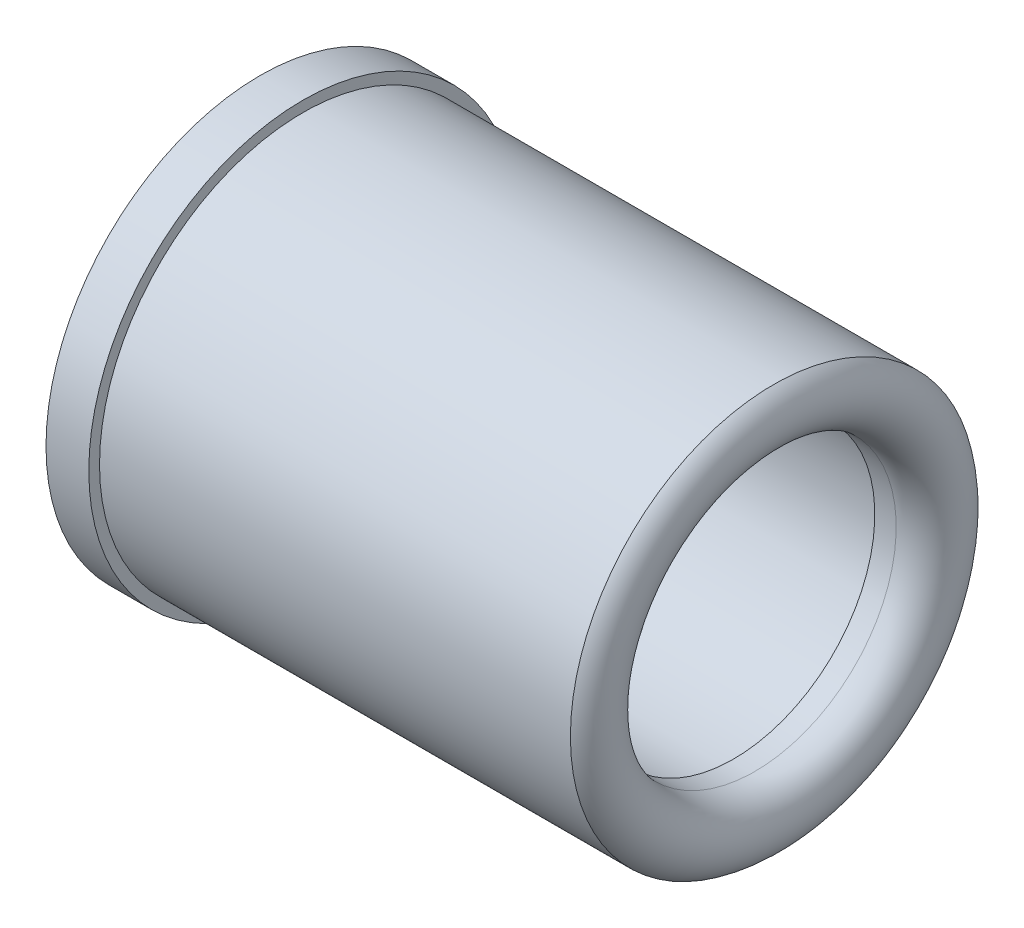
ISO-10303-21;
HEADER;
FILE_DESCRIPTION(('STEP AP214'),'2;1');
FILE_NAME('part.step','',(''),(''),'','','');
FILE_SCHEMA(('AUTOMOTIVE_DESIGN { 1 0 10303 214 1 1 1 1 }'));
ENDSEC;
DATA;
#1=APPLICATION_CONTEXT('core data for automotive mechanical design processes');
#2=APPLICATION_PROTOCOL_DEFINITION('international standard','automotive_design',2000,#1);
#3=PRODUCT_CONTEXT('',#1,'mechanical');
#4=PRODUCT('Part','Part','',(#3));
#5=PRODUCT_RELATED_PRODUCT_CATEGORY('part','',(#4));
#6=PRODUCT_DEFINITION_FORMATION('','',#4);
#7=PRODUCT_DEFINITION_CONTEXT('part definition',#1,'design');
#8=PRODUCT_DEFINITION('design','',#6,#7);
#9=PRODUCT_DEFINITION_SHAPE('','',#8);
#10=(LENGTH_UNIT() NAMED_UNIT(*) SI_UNIT(.MILLI.,.METRE.));
#11=(NAMED_UNIT(*) PLANE_ANGLE_UNIT() SI_UNIT($,.RADIAN.));
#12=(NAMED_UNIT(*) SI_UNIT($,.STERADIAN.) SOLID_ANGLE_UNIT());
#13=UNCERTAINTY_MEASURE_WITH_UNIT(LENGTH_MEASURE(1.E-05),#10,'distance_accuracy_value','');
#14=(GEOMETRIC_REPRESENTATION_CONTEXT(3) GLOBAL_UNCERTAINTY_ASSIGNED_CONTEXT((#13)) GLOBAL_UNIT_ASSIGNED_CONTEXT((#10,
#11,#12)) REPRESENTATION_CONTEXT('',''));
#15=CARTESIAN_POINT('',(0.,0.,0.));
#16=DIRECTION('',(0.,0.,1.));
#17=DIRECTION('',(1.,0.,0.));
#18=AXIS2_PLACEMENT_3D('',#15,#16,#17);
#19=CARTESIAN_POINT('',(12.1757416936097,-8.53326323507829,0.));
#20=DIRECTION('',(-1.,0.,0.));
#21=DIRECTION('',(0.,0.,1.));
#22=AXIS2_PLACEMENT_3D('',#19,#20,#21);
#23=CYLINDRICAL_SURFACE('',#22,3.3);
#24=CARTESIAN_POINT('',(11.9728126653829,-8.53326323507829,0.));
#25=DIRECTION('',(-1.,0.,0.));
#26=DIRECTION('',(0.,0.,1.));
#27=AXIS2_PLACEMENT_3D('',#24,#25,#26);
#28=CIRCLE('',#27,3.3);
#29=CARTESIAN_POINT('',(11.9728126653829,-8.53326323507829,3.3));
#30=VERTEX_POINT('',#29);
#31=EDGE_CURVE('E10',#30,#30,#28,.T.);
#32=ORIENTED_EDGE('',*,*,#31,.T.);
#33=EDGE_LOOP('',(#32));
#34=FACE_BOUND('',#33,.T.);
#35=CARTESIAN_POINT('',(12.4728126653829,-8.53326323507829,0.));
#36=DIRECTION('',(-1.,0.,0.));
#37=DIRECTION('',(0.,0.,1.));
#38=AXIS2_PLACEMENT_3D('',#35,#36,#37);
#39=CIRCLE('',#38,3.3);
#40=CARTESIAN_POINT('',(12.4728126653829,-8.53326323507829,3.3));
#41=VERTEX_POINT('',#40);
#42=EDGE_CURVE('E61',#41,#41,#39,.T.);
#43=ORIENTED_EDGE('',*,*,#42,.F.);
#44=EDGE_LOOP('',(#43));
#45=FACE_BOUND('',#44,.T.);
#46=ADVANCED_FACE('F33',(#34,#45),#23,.F.);
#47=CARTESIAN_POINT('',(11.9728126653829,-5.23326323507829,0.));
#48=DIRECTION('',(-1.,0.,0.));
#49=DIRECTION('',(0.,0.,1.));
#50=AXIS2_PLACEMENT_3D('',#47,#48,#49);
#51=PLANE('',#50);
#52=CARTESIAN_POINT('',(11.9728126653829,-8.53326323507829,0.));
#53=DIRECTION('',(-1.,0.,0.));
#54=DIRECTION('',(0.,0.,1.));
#55=AXIS2_PLACEMENT_3D('',#52,#53,#54);
#56=CIRCLE('',#55,3.55);
#57=CARTESIAN_POINT('',(11.9728126653829,-8.53326323507829,3.55));
#58=VERTEX_POINT('',#57);
#59=EDGE_CURVE('E39',#58,#58,#56,.T.);
#60=ORIENTED_EDGE('',*,*,#59,.T.);
#61=EDGE_LOOP('',(#60));
#62=FACE_BOUND('',#61,.T.);
#63=ORIENTED_EDGE('',*,*,#31,.F.);
#64=EDGE_LOOP('',(#63));
#65=FACE_BOUND('',#64,.T.);
#66=ADVANCED_FACE('F69',(#62,#65),#51,.T.);
#67=CARTESIAN_POINT('',(12.1757416936097,-8.53326323507829,0.));
#68=DIRECTION('',(-1.,0.,0.));
#69=DIRECTION('',(0.,0.,1.));
#70=AXIS2_PLACEMENT_3D('',#67,#68,#69);
#71=CYLINDRICAL_SURFACE('',#70,3.55);
#72=CARTESIAN_POINT('',(0.912123334161097,-8.53326323507829,0.));
#73=DIRECTION('',(-1.,0.,0.));
#74=DIRECTION('',(0.,0.,1.));
#75=AXIS2_PLACEMENT_3D('',#72,#73,#74);
#76=CIRCLE('',#75,3.55);
#77=CARTESIAN_POINT('',(0.912123334161097,-8.53326323507829,3.55));
#78=VERTEX_POINT('',#77);
#79=EDGE_CURVE('E43',#78,#78,#76,.T.);
#80=ORIENTED_EDGE('',*,*,#79,.T.);
#81=EDGE_LOOP('',(#80));
#82=FACE_BOUND('',#81,.T.);
#83=ORIENTED_EDGE('',*,*,#59,.F.);
#84=EDGE_LOOP('',(#83));
#85=FACE_BOUND('',#84,.T.);
#86=ADVANCED_FACE('F73',(#82,#85),#71,.F.);
#87=CARTESIAN_POINT('',(0.912123334161096,-4.98326323507829,0.));
#88=DIRECTION('',(-1.,0.,0.));
#89=DIRECTION('',(0.,0.,1.));
#90=AXIS2_PLACEMENT_3D('',#87,#88,#89);
#91=PLANE('',#90);
#92=CARTESIAN_POINT('',(0.912123334161097,-8.53326323507829,0.));
#93=DIRECTION('',(-1.,0.,0.));
#94=DIRECTION('',(0.,0.,1.));
#95=AXIS2_PLACEMENT_3D('',#92,#93,#94);
#96=CIRCLE('',#95,5.);
#97=CARTESIAN_POINT('',(0.912123334161097,-8.53326323507829,5.));
#98=VERTEX_POINT('',#97);
#99=EDGE_CURVE('E47',#98,#98,#96,.T.);
#100=ORIENTED_EDGE('',*,*,#99,.T.);
#101=EDGE_LOOP('',(#100));
#102=FACE_BOUND('',#101,.T.);
#103=ORIENTED_EDGE('',*,*,#79,.F.);
#104=EDGE_LOOP('',(#103));
#105=FACE_BOUND('',#104,.T.);
#106=ADVANCED_FACE('F77',(#102,#105),#91,.T.);
#107=CARTESIAN_POINT('',(12.1757416936097,-8.53326323507829,0.));
#108=DIRECTION('',(-1.,0.,0.));
#109=DIRECTION('',(0.,0.,1.));
#110=AXIS2_PLACEMENT_3D('',#107,#108,#109);
#111=CYLINDRICAL_SURFACE('',#110,5.);
#112=CARTESIAN_POINT('',(1.9121233341611,-8.53326323507829,0.));
#113=DIRECTION('',(-1.,0.,0.));
#114=DIRECTION('',(0.,0.,1.));
#115=AXIS2_PLACEMENT_3D('',#112,#113,#114);
#116=CIRCLE('',#115,5.);
#117=CARTESIAN_POINT('',(1.9121233341611,-8.53326323507829,5.));
#118=VERTEX_POINT('',#117);
#119=EDGE_CURVE('E52',#118,#118,#116,.T.);
#120=ORIENTED_EDGE('',*,*,#119,.T.);
#121=EDGE_LOOP('',(#120));
#122=FACE_BOUND('',#121,.T.);
#123=ORIENTED_EDGE('',*,*,#99,.F.);
#124=EDGE_LOOP('',(#123));
#125=FACE_BOUND('',#124,.T.);
#126=ADVANCED_FACE('F84',(#122,#125),#111,.T.);
#127=CARTESIAN_POINT('',(1.9121233341611,-3.53326323507829,0.));
#128=DIRECTION('',(1.,0.,0.));
#129=DIRECTION('',(0.,0.,-1.));
#130=AXIS2_PLACEMENT_3D('',#127,#128,#129);
#131=PLANE('',#130);
#132=CARTESIAN_POINT('',(1.9121233341611,-8.53326323507829,0.));
#133=DIRECTION('',(-1.,0.,0.));
#134=DIRECTION('',(0.,0.,1.));
#135=AXIS2_PLACEMENT_3D('',#132,#133,#134);
#136=CIRCLE('',#135,4.75);
#137=CARTESIAN_POINT('',(1.9121233341611,-8.53326323507829,4.75));
#138=VERTEX_POINT('',#137);
#139=EDGE_CURVE('E55',#138,#138,#136,.T.);
#140=ORIENTED_EDGE('',*,*,#139,.T.);
#141=EDGE_LOOP('',(#140));
#142=FACE_BOUND('',#141,.T.);
#143=ORIENTED_EDGE('',*,*,#119,.F.);
#144=EDGE_LOOP('',(#143));
#145=FACE_BOUND('',#144,.T.);
#146=ADVANCED_FACE('F88',(#142,#145),#131,.T.);
#147=CARTESIAN_POINT('',(12.1757416936097,-8.53326323507829,0.));
#148=DIRECTION('',(-1.,0.,0.));
#149=DIRECTION('',(0.,0.,1.));
#150=AXIS2_PLACEMENT_3D('',#147,#148,#149);
#151=CYLINDRICAL_SURFACE('',#150,4.75);
#152=CARTESIAN_POINT('',(12.9121233341611,-8.53326323507829,0.));
#153=DIRECTION('',(-1.,0.,0.));
#154=DIRECTION('',(0.,0.,1.));
#155=AXIS2_PLACEMENT_3D('',#152,#153,#154);
#156=CIRCLE('',#155,4.75);
#157=CARTESIAN_POINT('',(12.9121233341611,-8.53326323507829,4.75));
#158=VERTEX_POINT('',#157);
#159=EDGE_CURVE('E58',#158,#158,#156,.T.);
#160=ORIENTED_EDGE('',*,*,#159,.T.);
#161=EDGE_LOOP('',(#160));
#162=FACE_BOUND('',#161,.T.);
#163=ORIENTED_EDGE('',*,*,#139,.F.);
#164=EDGE_LOOP('',(#163));
#165=FACE_BOUND('',#164,.T.);
#166=ADVANCED_FACE('F92',(#162,#165),#151,.T.);
#167=CARTESIAN_POINT('',(12.4728126653829,-8.53326323507829,0.));
#168=DIRECTION('',(-1.,0.,0.));
#169=DIRECTION('',(0.,0.,1.));
#170=AXIS2_PLACEMENT_3D('',#167,#168,#169);
#171=TOROIDAL_SURFACE('',#170,4.09154960817322,0.791549608173223);
#172=ORIENTED_EDGE('',*,*,#42,.T.);
#173=EDGE_LOOP('',(#172));
#174=FACE_BOUND('',#173,.T.);
#175=ORIENTED_EDGE('',*,*,#159,.F.);
#176=EDGE_LOOP('',(#175));
#177=FACE_BOUND('',#176,.T.);
#178=ADVANCED_FACE('F65',(#174,#177),#171,.T.);
#179=CLOSED_SHELL('',(#46,#66,#86,#106,#126,#146,#166,#178));
#180=MANIFOLD_SOLID_BREP('B2',#179);
#181=ADVANCED_BREP_SHAPE_REPRESENTATION('',(#18,#180),#14);
#182=SHAPE_DEFINITION_REPRESENTATION(#9,#181);
ENDSEC;
END-ISO-10303-21;
